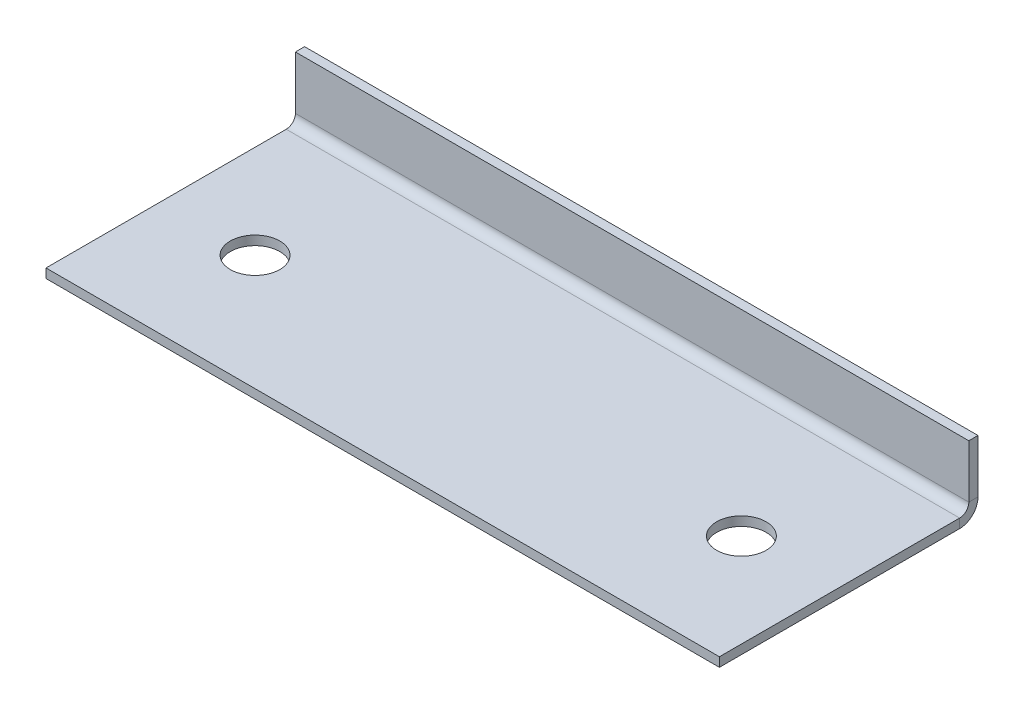
ISO-10303-21;
HEADER;
FILE_DESCRIPTION(('STEP AP214'),'2;1');
FILE_NAME('part.step','',(''),(''),'','','');
FILE_SCHEMA(('AUTOMOTIVE_DESIGN { 1 0 10303 214 1 1 1 1 }'));
ENDSEC;
DATA;
#1=APPLICATION_CONTEXT('core data for automotive mechanical design processes');
#2=APPLICATION_PROTOCOL_DEFINITION('international standard','automotive_design',2000,#1);
#3=PRODUCT_CONTEXT('',#1,'mechanical');
#4=PRODUCT('Part','Part','',(#3));
#5=PRODUCT_RELATED_PRODUCT_CATEGORY('part','',(#4));
#6=PRODUCT_DEFINITION_FORMATION('','',#4);
#7=PRODUCT_DEFINITION_CONTEXT('part definition',#1,'design');
#8=PRODUCT_DEFINITION('design','',#6,#7);
#9=PRODUCT_DEFINITION_SHAPE('','',#8);
#10=(LENGTH_UNIT() NAMED_UNIT(*) SI_UNIT(.MILLI.,.METRE.));
#11=(NAMED_UNIT(*) PLANE_ANGLE_UNIT() SI_UNIT($,.RADIAN.));
#12=(NAMED_UNIT(*) SI_UNIT($,.STERADIAN.) SOLID_ANGLE_UNIT());
#13=UNCERTAINTY_MEASURE_WITH_UNIT(LENGTH_MEASURE(1.E-05),#10,'distance_accuracy_value','');
#14=(GEOMETRIC_REPRESENTATION_CONTEXT(3) GLOBAL_UNCERTAINTY_ASSIGNED_CONTEXT((#13)) GLOBAL_UNIT_ASSIGNED_CONTEXT((#10,
#11,#12)) REPRESENTATION_CONTEXT('',''));
#15=CARTESIAN_POINT('',(0.,0.,0.));
#16=DIRECTION('',(0.,0.,1.));
#17=DIRECTION('',(1.,0.,0.));
#18=AXIS2_PLACEMENT_3D('',#15,#16,#17);
#19=CARTESIAN_POINT('',(54.,0.736600000000003,-10.));
#20=DIRECTION('',(1.,0.,0.));
#21=DIRECTION('',(0.,0.,-1.));
#22=AXIS2_PLACEMENT_3D('',#19,#20,#21);
#23=PLANE('',#22);
#24=DIRECTION('',(0.,0.,-1.));
#25=VECTOR('',#24,1.);
#26=CARTESIAN_POINT('',(54.,0.736600000000003,-10.));
#27=LINE('',#26,#25);
#28=CARTESIAN_POINT('',(54.,0.736600000000003,-10.));
#29=VERTEX_POINT('',#28);
#30=CARTESIAN_POINT('',(54.,0.736600000000003,-10.7366));
#31=VERTEX_POINT('',#30);
#32=EDGE_CURVE('E11',#29,#31,#27,.T.);
#33=ORIENTED_EDGE('',*,*,#32,.F.);
#34=CARTESIAN_POINT('',(54.,0.736600000000003,-9.2634));
#35=DIRECTION('',(-1.,0.,0.));
#36=DIRECTION('',(0.,0.,1.));
#37=AXIS2_PLACEMENT_3D('',#34,#35,#36);
#38=CIRCLE('',#37,0.7366);
#39=CARTESIAN_POINT('',(54.,0.,-9.2634));
#40=VERTEX_POINT('',#39);
#41=EDGE_CURVE('E135',#40,#29,#38,.F.);
#42=ORIENTED_EDGE('',*,*,#41,.F.);
#43=DIRECTION('',(0.,1.,0.));
#44=VECTOR('',#43,1.);
#45=CARTESIAN_POINT('',(54.,-0.736599999999997,-9.2634));
#46=LINE('',#45,#44);
#47=CARTESIAN_POINT('',(54.,-0.736599999999997,-9.2634));
#48=VERTEX_POINT('',#47);
#49=EDGE_CURVE('E46',#48,#40,#46,.T.);
#50=ORIENTED_EDGE('',*,*,#49,.F.);
#51=CARTESIAN_POINT('',(54.,0.736600000000003,-9.2634));
#52=DIRECTION('',(1.,0.,0.));
#53=DIRECTION('',(0.,0.,-1.));
#54=AXIS2_PLACEMENT_3D('',#51,#52,#53);
#55=CIRCLE('',#54,1.4732);
#56=EDGE_CURVE('E128',#48,#31,#55,.T.);
#57=ORIENTED_EDGE('',*,*,#56,.T.);
#58=EDGE_LOOP('',(#33,#42,#50,#57));
#59=FACE_BOUND('',#58,.T.);
#60=ADVANCED_FACE('F38',(#59),#23,.T.);
#61=CARTESIAN_POINT('',(54.,-0.736599999999997,-9.2634));
#62=DIRECTION('',(1.,0.,0.));
#63=DIRECTION('',(0.,0.,-1.));
#64=AXIS2_PLACEMENT_3D('',#61,#62,#63);
#65=PLANE('',#64);
#66=DIRECTION('',(0.,1.,0.));
#67=VECTOR('',#66,1.);
#68=CARTESIAN_POINT('',(54.,0.,-10.));
#69=LINE('',#68,#67);
#70=CARTESIAN_POINT('',(54.,5.,-10.));
#71=VERTEX_POINT('',#70);
#72=EDGE_CURVE('E185',#29,#71,#69,.T.);
#73=ORIENTED_EDGE('',*,*,#72,.F.);
#74=ORIENTED_EDGE('',*,*,#32,.T.);
#75=DIRECTION('',(0.,1.,0.));
#76=VECTOR('',#75,1.);
#77=CARTESIAN_POINT('',(54.,0.,-10.7366));
#78=LINE('',#77,#76);
#79=CARTESIAN_POINT('',(54.,5.,-10.7366));
#80=VERTEX_POINT('',#79);
#81=EDGE_CURVE('E94',#31,#80,#78,.T.);
#82=ORIENTED_EDGE('',*,*,#81,.T.);
#83=DIRECTION('',(0.,0.,-1.));
#84=VECTOR('',#83,1.);
#85=CARTESIAN_POINT('',(54.,5.,-10.));
#86=LINE('',#85,#84);
#87=EDGE_CURVE('E381',#71,#80,#86,.T.);
#88=ORIENTED_EDGE('',*,*,#87,.F.);
#89=EDGE_LOOP('',(#73,#74,#82,#88));
#90=FACE_BOUND('',#89,.T.);
#91=ADVANCED_FACE('F193',(#90),#65,.T.);
#92=CARTESIAN_POINT('',(0.,0.,-9.2634));
#93=DIRECTION('',(-1.,0.,0.));
#94=DIRECTION('',(0.,0.,1.));
#95=AXIS2_PLACEMENT_3D('',#92,#93,#94);
#96=PLANE('',#95);
#97=DIRECTION('',(0.,-1.,0.));
#98=VECTOR('',#97,1.);
#99=CARTESIAN_POINT('',(0.,0.,-9.2634));
#100=LINE('',#99,#98);
#101=CARTESIAN_POINT('',(0.,0.,-9.2634));
#102=VERTEX_POINT('',#101);
#103=CARTESIAN_POINT('',(0.,-0.736599999999997,-9.2634));
#104=VERTEX_POINT('',#103);
#105=EDGE_CURVE('E81',#102,#104,#100,.T.);
#106=ORIENTED_EDGE('',*,*,#105,.F.);
#107=CARTESIAN_POINT('',(0.,0.736600000000003,-9.2634));
#108=DIRECTION('',(-1.,0.,0.));
#109=DIRECTION('',(0.,0.,1.));
#110=AXIS2_PLACEMENT_3D('',#107,#108,#109);
#111=CIRCLE('',#110,0.7366);
#112=CARTESIAN_POINT('',(0.,0.736600000000003,-10.));
#113=VERTEX_POINT('',#112);
#114=EDGE_CURVE('E151',#102,#113,#111,.F.);
#115=ORIENTED_EDGE('',*,*,#114,.T.);
#116=DIRECTION('',(0.,0.,1.));
#117=VECTOR('',#116,1.);
#118=CARTESIAN_POINT('',(0.,0.736600000000003,-10.7366));
#119=LINE('',#118,#117);
#120=CARTESIAN_POINT('',(0.,0.736600000000003,-10.7366));
#121=VERTEX_POINT('',#120);
#122=EDGE_CURVE('E88',#121,#113,#119,.T.);
#123=ORIENTED_EDGE('',*,*,#122,.F.);
#124=CARTESIAN_POINT('',(0.,0.736600000000003,-9.2634));
#125=DIRECTION('',(1.,0.,0.));
#126=DIRECTION('',(0.,0.,-1.));
#127=AXIS2_PLACEMENT_3D('',#124,#125,#126);
#128=CIRCLE('',#127,1.4732);
#129=EDGE_CURVE('E158',#104,#121,#128,.T.);
#130=ORIENTED_EDGE('',*,*,#129,.F.);
#131=EDGE_LOOP('',(#106,#115,#123,#130));
#132=FACE_BOUND('',#131,.T.);
#133=ADVANCED_FACE('F191',(#132),#96,.T.);
#134=CARTESIAN_POINT('',(0.,0.736600000000003,-10.7366));
#135=DIRECTION('',(-1.,0.,0.));
#136=DIRECTION('',(0.,0.,1.));
#137=AXIS2_PLACEMENT_3D('',#134,#135,#136);
#138=PLANE('',#137);
#139=DIRECTION('',(0.,0.,-1.));
#140=VECTOR('',#139,1.);
#141=CARTESIAN_POINT('',(0.,0.,10.));
#142=LINE('',#141,#140);
#143=CARTESIAN_POINT('',(0.,0.,10.));
#144=VERTEX_POINT('',#143);
#145=EDGE_CURVE('E153',#144,#102,#142,.T.);
#146=ORIENTED_EDGE('',*,*,#145,.T.);
#147=ORIENTED_EDGE('',*,*,#105,.T.);
#148=DIRECTION('',(0.,0.,-1.));
#149=VECTOR('',#148,1.);
#150=CARTESIAN_POINT('',(0.,-0.7366,10.));
#151=LINE('',#150,#149);
#152=CARTESIAN_POINT('',(0.,-0.7366,10.));
#153=VERTEX_POINT('',#152);
#154=EDGE_CURVE('E156',#153,#104,#151,.T.);
#155=ORIENTED_EDGE('',*,*,#154,.F.);
#156=DIRECTION('',(0.,1.,0.));
#157=VECTOR('',#156,1.);
#158=CARTESIAN_POINT('',(0.,-0.7366,10.));
#159=LINE('',#158,#157);
#160=EDGE_CURVE('E116',#153,#144,#159,.T.);
#161=ORIENTED_EDGE('',*,*,#160,.T.);
#162=EDGE_LOOP('',(#146,#147,#155,#161));
#163=FACE_BOUND('',#162,.T.);
#164=ADVANCED_FACE('F187',(#163),#138,.T.);
#165=CARTESIAN_POINT('',(54.,0.,-10.7366));
#166=DIRECTION('',(0.,0.,1.));
#167=DIRECTION('',(0.,-1.,0.));
#168=AXIS2_PLACEMENT_3D('',#165,#166,#167);
#169=PLANE('',#168);
#170=DIRECTION('',(0.,1.,0.));
#171=VECTOR('',#170,1.);
#172=CARTESIAN_POINT('',(0.,0.,-10.7366));
#173=LINE('',#172,#171);
#174=CARTESIAN_POINT('',(0.,5.,-10.7366));
#175=VERTEX_POINT('',#174);
#176=EDGE_CURVE('E141',#121,#175,#173,.T.);
#177=ORIENTED_EDGE('',*,*,#176,.T.);
#178=DIRECTION('',(-1.,0.,0.));
#179=VECTOR('',#178,1.);
#180=CARTESIAN_POINT('',(54.,5.,-10.7366));
#181=LINE('',#180,#179);
#182=EDGE_CURVE('E172',#80,#175,#181,.T.);
#183=ORIENTED_EDGE('',*,*,#182,.F.);
#184=ORIENTED_EDGE('',*,*,#81,.F.);
#185=DIRECTION('',(-1.,0.,0.));
#186=VECTOR('',#185,1.);
#187=CARTESIAN_POINT('',(54.,0.736600000000003,-10.7366));
#188=LINE('',#187,#186);
#189=EDGE_CURVE('E140',#31,#121,#188,.T.);
#190=ORIENTED_EDGE('',*,*,#189,.T.);
#191=EDGE_LOOP('',(#177,#183,#184,#190));
#192=FACE_BOUND('',#191,.T.);
#193=ADVANCED_FACE('F199',(#192),#169,.F.);
#194=CARTESIAN_POINT('',(54.,5.,-10.));
#195=DIRECTION('',(0.,1.,0.));
#196=DIRECTION('',(0.,0.,1.));
#197=AXIS2_PLACEMENT_3D('',#194,#195,#196);
#198=PLANE('',#197);
#199=DIRECTION('',(0.,0.,-1.));
#200=VECTOR('',#199,1.);
#201=CARTESIAN_POINT('',(0.,5.,-10.));
#202=LINE('',#201,#200);
#203=CARTESIAN_POINT('',(0.,5.,-10.));
#204=VERTEX_POINT('',#203);
#205=EDGE_CURVE('E144',#204,#175,#202,.T.);
#206=ORIENTED_EDGE('',*,*,#205,.F.);
#207=DIRECTION('',(-1.,0.,0.));
#208=VECTOR('',#207,1.);
#209=CARTESIAN_POINT('',(54.,5.,-10.));
#210=LINE('',#209,#208);
#211=EDGE_CURVE('E170',#71,#204,#210,.T.);
#212=ORIENTED_EDGE('',*,*,#211,.F.);
#213=ORIENTED_EDGE('',*,*,#87,.T.);
#214=ORIENTED_EDGE('',*,*,#182,.T.);
#215=EDGE_LOOP('',(#206,#212,#213,#214));
#216=FACE_BOUND('',#215,.T.);
#217=ADVANCED_FACE('F230',(#216),#198,.T.);
#218=CARTESIAN_POINT('',(54.,0.,-10.));
#219=DIRECTION('',(0.,0.,1.));
#220=DIRECTION('',(0.,-1.,0.));
#221=AXIS2_PLACEMENT_3D('',#218,#219,#220);
#222=PLANE('',#221);
#223=DIRECTION('',(0.,1.,0.));
#224=VECTOR('',#223,1.);
#225=CARTESIAN_POINT('',(0.,0.,-10.));
#226=LINE('',#225,#224);
#227=EDGE_CURVE('E148',#113,#204,#226,.T.);
#228=ORIENTED_EDGE('',*,*,#227,.F.);
#229=DIRECTION('',(-1.,0.,0.));
#230=VECTOR('',#229,1.);
#231=CARTESIAN_POINT('',(54.,0.736600000000003,-10.));
#232=LINE('',#231,#230);
#233=EDGE_CURVE('E167',#29,#113,#232,.T.);
#234=ORIENTED_EDGE('',*,*,#233,.F.);
#235=ORIENTED_EDGE('',*,*,#72,.T.);
#236=ORIENTED_EDGE('',*,*,#211,.T.);
#237=EDGE_LOOP('',(#228,#234,#235,#236));
#238=FACE_BOUND('',#237,.T.);
#239=ADVANCED_FACE('F241',(#238),#222,.T.);
#240=CARTESIAN_POINT('',(54.,0.736600000000003,-9.2634));
#241=DIRECTION('',(-1.,0.,0.));
#242=DIRECTION('',(0.,0.,1.));
#243=AXIS2_PLACEMENT_3D('',#240,#241,#242);
#244=CYLINDRICAL_SURFACE('',#243,0.7366);
#245=ORIENTED_EDGE('',*,*,#114,.F.);
#246=DIRECTION('',(-1.,0.,0.));
#247=VECTOR('',#246,1.);
#248=CARTESIAN_POINT('',(54.,0.,-9.2634));
#249=LINE('',#248,#247);
#250=EDGE_CURVE('E164',#40,#102,#249,.T.);
#251=ORIENTED_EDGE('',*,*,#250,.F.);
#252=ORIENTED_EDGE('',*,*,#41,.T.);
#253=ORIENTED_EDGE('',*,*,#233,.T.);
#254=EDGE_LOOP('',(#245,#251,#252,#253));
#255=FACE_BOUND('',#254,.T.);
#256=ADVANCED_FACE('F181',(#255),#244,.F.);
#257=CARTESIAN_POINT('',(54.,0.,10.));
#258=DIRECTION('',(0.,1.,0.));
#259=DIRECTION('',(0.,0.,1.));
#260=AXIS2_PLACEMENT_3D('',#257,#258,#259);
#261=PLANE('',#260);
#262=CARTESIAN_POINT('',(46.5,0.,0.736600000000002));
#263=DIRECTION('',(0.,1.,0.));
#264=DIRECTION('',(0.,0.,1.));
#265=AXIS2_PLACEMENT_3D('',#262,#263,#264);
#266=CIRCLE('',#265,1.984375);
#267=CARTESIAN_POINT('',(46.5,0.,2.720975));
#268=VERTEX_POINT('',#267);
#269=EDGE_CURVE('E371',#268,#268,#266,.T.);
#270=ORIENTED_EDGE('',*,*,#269,.F.);
#271=EDGE_LOOP('',(#270));
#272=FACE_BOUND('',#271,.T.);
#273=CARTESIAN_POINT('',(7.5,0.,0.7366));
#274=DIRECTION('',(0.,1.,0.));
#275=DIRECTION('',(0.,0.,1.));
#276=AXIS2_PLACEMENT_3D('',#273,#274,#275);
#277=CIRCLE('',#276,1.984375);
#278=CARTESIAN_POINT('',(7.5,0.,2.720975));
#279=VERTEX_POINT('',#278);
#280=EDGE_CURVE('E373',#279,#279,#277,.T.);
#281=ORIENTED_EDGE('',*,*,#280,.F.);
#282=EDGE_LOOP('',(#281));
#283=FACE_BOUND('',#282,.T.);
#284=ORIENTED_EDGE('',*,*,#145,.F.);
#285=DIRECTION('',(-1.,0.,0.));
#286=VECTOR('',#285,1.);
#287=CARTESIAN_POINT('',(54.,0.,10.));
#288=LINE('',#287,#286);
#289=CARTESIAN_POINT('',(54.,0.,10.));
#290=VERTEX_POINT('',#289);
#291=EDGE_CURVE('E118',#290,#144,#288,.T.);
#292=ORIENTED_EDGE('',*,*,#291,.F.);
#293=DIRECTION('',(0.,0.,-1.));
#294=VECTOR('',#293,1.);
#295=CARTESIAN_POINT('',(54.,0.,10.));
#296=LINE('',#295,#294);
#297=EDGE_CURVE('E133',#290,#40,#296,.T.);
#298=ORIENTED_EDGE('',*,*,#297,.T.);
#299=ORIENTED_EDGE('',*,*,#250,.T.);
#300=EDGE_LOOP('',(#284,#292,#298,#299));
#301=FACE_BOUND('',#300,.T.);
#302=ADVANCED_FACE('F186',(#272,#283,#301),#261,.T.);
#303=CARTESIAN_POINT('',(54.,-0.7366,10.));
#304=DIRECTION('',(0.,0.,1.));
#305=DIRECTION('',(1.,0.,0.));
#306=AXIS2_PLACEMENT_3D('',#303,#304,#305);
#307=PLANE('',#306);
#308=ORIENTED_EDGE('',*,*,#160,.F.);
#309=DIRECTION('',(-1.,0.,0.));
#310=VECTOR('',#309,1.);
#311=CARTESIAN_POINT('',(54.,-0.7366,10.));
#312=LINE('',#311,#310);
#313=CARTESIAN_POINT('',(54.,-0.7366,10.));
#314=VERTEX_POINT('',#313);
#315=EDGE_CURVE('E110',#314,#153,#312,.T.);
#316=ORIENTED_EDGE('',*,*,#315,.F.);
#317=DIRECTION('',(0.,1.,0.));
#318=VECTOR('',#317,1.);
#319=CARTESIAN_POINT('',(54.,-0.7366,10.));
#320=LINE('',#319,#318);
#321=EDGE_CURVE('E114',#314,#290,#320,.T.);
#322=ORIENTED_EDGE('',*,*,#321,.T.);
#323=ORIENTED_EDGE('',*,*,#291,.T.);
#324=EDGE_LOOP('',(#308,#316,#322,#323));
#325=FACE_BOUND('',#324,.T.);
#326=ADVANCED_FACE('F112',(#325),#307,.T.);
#327=CARTESIAN_POINT('',(54.,-0.7366,10.));
#328=DIRECTION('',(0.,1.,0.));
#329=DIRECTION('',(0.,0.,1.));
#330=AXIS2_PLACEMENT_3D('',#327,#328,#329);
#331=PLANE('',#330);
#332=CARTESIAN_POINT('',(46.5,-0.736600000000002,0.736600000000002));
#333=DIRECTION('',(0.,1.,0.));
#334=DIRECTION('',(0.,0.,1.));
#335=AXIS2_PLACEMENT_3D('',#332,#333,#334);
#336=CIRCLE('',#335,1.984375);
#337=CARTESIAN_POINT('',(46.5,-0.736600000000002,2.720975));
#338=VERTEX_POINT('',#337);
#339=EDGE_CURVE('E368',#338,#338,#336,.T.);
#340=ORIENTED_EDGE('',*,*,#339,.T.);
#341=EDGE_LOOP('',(#340));
#342=FACE_BOUND('',#341,.T.);
#343=CARTESIAN_POINT('',(7.5,-0.736600000000002,0.7366));
#344=DIRECTION('',(0.,1.,0.));
#345=DIRECTION('',(0.,0.,1.));
#346=AXIS2_PLACEMENT_3D('',#343,#344,#345);
#347=CIRCLE('',#346,1.984375);
#348=CARTESIAN_POINT('',(7.5,-0.736600000000002,2.720975));
#349=VERTEX_POINT('',#348);
#350=EDGE_CURVE('E145',#349,#349,#347,.T.);
#351=ORIENTED_EDGE('',*,*,#350,.T.);
#352=EDGE_LOOP('',(#351));
#353=FACE_BOUND('',#352,.T.);
#354=ORIENTED_EDGE('',*,*,#154,.T.);
#355=DIRECTION('',(-1.,0.,0.));
#356=VECTOR('',#355,1.);
#357=CARTESIAN_POINT('',(54.,-0.736599999999997,-9.2634));
#358=LINE('',#357,#356);
#359=EDGE_CURVE('E119',#48,#104,#358,.T.);
#360=ORIENTED_EDGE('',*,*,#359,.F.);
#361=DIRECTION('',(0.,0.,-1.));
#362=VECTOR('',#361,1.);
#363=CARTESIAN_POINT('',(54.,-0.7366,10.));
#364=LINE('',#363,#362);
#365=EDGE_CURVE('E123',#314,#48,#364,.T.);
#366=ORIENTED_EDGE('',*,*,#365,.F.);
#367=ORIENTED_EDGE('',*,*,#315,.T.);
#368=EDGE_LOOP('',(#354,#360,#366,#367));
#369=FACE_BOUND('',#368,.T.);
#370=ADVANCED_FACE('F124',(#342,#353,#369),#331,.F.);
#371=CARTESIAN_POINT('',(54.,0.736600000000003,-9.2634));
#372=DIRECTION('',(-1.,0.,0.));
#373=DIRECTION('',(0.,0.,1.));
#374=AXIS2_PLACEMENT_3D('',#371,#372,#373);
#375=CYLINDRICAL_SURFACE('',#374,1.4732);
#376=ORIENTED_EDGE('',*,*,#129,.T.);
#377=ORIENTED_EDGE('',*,*,#189,.F.);
#378=ORIENTED_EDGE('',*,*,#56,.F.);
#379=ORIENTED_EDGE('',*,*,#359,.T.);
#380=EDGE_LOOP('',(#376,#377,#378,#379));
#381=FACE_BOUND('',#380,.T.);
#382=ADVANCED_FACE('F189',(#381),#375,.T.);
#383=CARTESIAN_POINT('',(54.,0.736600000000003,-9.2634));
#384=DIRECTION('',(-1.,0.,0.));
#385=DIRECTION('',(0.,0.,1.));
#386=AXIS2_PLACEMENT_3D('',#383,#384,#385);
#387=PLANE('',#386);
#388=ORIENTED_EDGE('',*,*,#365,.T.);
#389=ORIENTED_EDGE('',*,*,#49,.T.);
#390=ORIENTED_EDGE('',*,*,#297,.F.);
#391=ORIENTED_EDGE('',*,*,#321,.F.);
#392=EDGE_LOOP('',(#388,#389,#390,#391));
#393=FACE_BOUND('',#392,.T.);
#394=ADVANCED_FACE('F131',(#393),#387,.F.);
#395=CARTESIAN_POINT('',(0.,0.736600000000003,-9.2634));
#396=DIRECTION('',(-1.,0.,0.));
#397=DIRECTION('',(0.,0.,1.));
#398=AXIS2_PLACEMENT_3D('',#395,#396,#397);
#399=PLANE('',#398);
#400=ORIENTED_EDGE('',*,*,#176,.F.);
#401=ORIENTED_EDGE('',*,*,#122,.T.);
#402=ORIENTED_EDGE('',*,*,#227,.T.);
#403=ORIENTED_EDGE('',*,*,#205,.T.);
#404=EDGE_LOOP('',(#400,#401,#402,#403));
#405=FACE_BOUND('',#404,.T.);
#406=ADVANCED_FACE('F293',(#405),#399,.T.);
#407=CARTESIAN_POINT('',(7.5,-0.736600000000002,0.7366));
#408=DIRECTION('',(0.,1.,0.));
#409=DIRECTION('',(0.,0.,1.));
#410=AXIS2_PLACEMENT_3D('',#407,#408,#409);
#411=CYLINDRICAL_SURFACE('',#410,1.984375);
#412=ORIENTED_EDGE('',*,*,#350,.F.);
#413=EDGE_LOOP('',(#412));
#414=FACE_BOUND('',#413,.T.);
#415=ORIENTED_EDGE('',*,*,#280,.T.);
#416=EDGE_LOOP('',(#415));
#417=FACE_BOUND('',#416,.T.);
#418=ADVANCED_FACE('F303',(#414,#417),#411,.F.);
#419=CARTESIAN_POINT('',(46.5,-0.736600000000002,0.736600000000002));
#420=DIRECTION('',(0.,1.,0.));
#421=DIRECTION('',(0.,0.,1.));
#422=AXIS2_PLACEMENT_3D('',#419,#420,#421);
#423=CYLINDRICAL_SURFACE('',#422,1.984375);
#424=ORIENTED_EDGE('',*,*,#339,.F.);
#425=EDGE_LOOP('',(#424));
#426=FACE_BOUND('',#425,.T.);
#427=ORIENTED_EDGE('',*,*,#269,.T.);
#428=EDGE_LOOP('',(#427));
#429=FACE_BOUND('',#428,.T.);
#430=ADVANCED_FACE('F330',(#426,#429),#423,.F.);
#431=CLOSED_SHELL('',(#60,#91,#133,#164,#193,#217,#239,#256,#302,#326,#370,#382,#394,#406,#418,#430));
#432=MANIFOLD_SOLID_BREP('B2',#431);
#433=ADVANCED_BREP_SHAPE_REPRESENTATION('',(#18,#432),#14);
#434=SHAPE_DEFINITION_REPRESENTATION(#9,#433);
ENDSEC;
END-ISO-10303-21;
